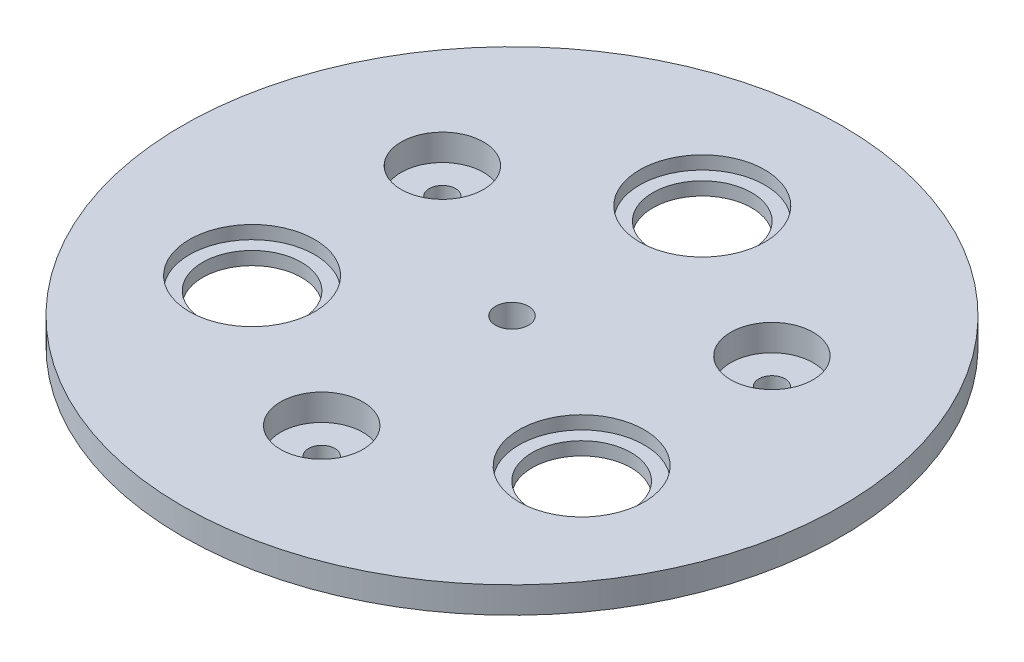
ISO-10303-21;
HEADER;
FILE_DESCRIPTION(('STEP AP214'),'2;1');
FILE_NAME('part.step','',(''),(''),'','','');
FILE_SCHEMA(('AUTOMOTIVE_DESIGN { 1 0 10303 214 1 1 1 1 }'));
ENDSEC;
DATA;
#1=APPLICATION_CONTEXT('core data for automotive mechanical design processes');
#2=APPLICATION_PROTOCOL_DEFINITION('international standard','automotive_design',2000,#1);
#3=PRODUCT_CONTEXT('',#1,'mechanical');
#4=PRODUCT('Part','Part','',(#3));
#5=PRODUCT_RELATED_PRODUCT_CATEGORY('part','',(#4));
#6=PRODUCT_DEFINITION_FORMATION('','',#4);
#7=PRODUCT_DEFINITION_CONTEXT('part definition',#1,'design');
#8=PRODUCT_DEFINITION('design','',#6,#7);
#9=PRODUCT_DEFINITION_SHAPE('','',#8);
#10=(LENGTH_UNIT() NAMED_UNIT(*) SI_UNIT(.MILLI.,.METRE.));
#11=(NAMED_UNIT(*) PLANE_ANGLE_UNIT() SI_UNIT($,.RADIAN.));
#12=(NAMED_UNIT(*) SI_UNIT($,.STERADIAN.) SOLID_ANGLE_UNIT());
#13=UNCERTAINTY_MEASURE_WITH_UNIT(LENGTH_MEASURE(1.E-05),#10,'distance_accuracy_value','');
#14=(GEOMETRIC_REPRESENTATION_CONTEXT(3) GLOBAL_UNCERTAINTY_ASSIGNED_CONTEXT((#13)) GLOBAL_UNIT_ASSIGNED_CONTEXT((#10,
#11,#12)) REPRESENTATION_CONTEXT('',''));
#15=CARTESIAN_POINT('',(0.,0.,0.));
#16=DIRECTION('',(0.,0.,1.));
#17=DIRECTION('',(1.,0.,0.));
#18=AXIS2_PLACEMENT_3D('',#15,#16,#17);
#19=CARTESIAN_POINT('',(0.,-2.,0.));
#20=DIRECTION('',(0.,1.,0.));
#21=DIRECTION('',(0.,0.,1.));
#22=AXIS2_PLACEMENT_3D('',#19,#20,#21);
#23=PLANE('',#22);
#24=CARTESIAN_POINT('',(0.,-2.,0.));
#25=DIRECTION('',(0.,1.,0.));
#26=DIRECTION('',(0.,0.,1.));
#27=AXIS2_PLACEMENT_3D('',#24,#25,#26);
#28=CIRCLE('',#27,2.5);
#29=CARTESIAN_POINT('',(0.,-2.,2.5));
#30=VERTEX_POINT('',#29);
#31=EDGE_CURVE('E63',#30,#30,#28,.T.);
#32=ORIENTED_EDGE('',*,*,#31,.T.);
#33=EDGE_LOOP('',(#32));
#34=FACE_BOUND('',#33,.T.);
#35=CARTESIAN_POINT('',(0.,-2.,0.));
#36=DIRECTION('',(0.,-1.,0.));
#37=DIRECTION('',(0.,0.,-1.));
#38=AXIS2_PLACEMENT_3D('',#35,#36,#37);
#39=CIRCLE('',#38,6.25);
#40=CARTESIAN_POINT('',(0.,-2.,-6.25));
#41=VERTEX_POINT('',#40);
#42=EDGE_CURVE('E150',#41,#41,#39,.T.);
#43=ORIENTED_EDGE('',*,*,#42,.T.);
#44=EDGE_LOOP('',(#43));
#45=FACE_BOUND('',#44,.T.);
#46=ADVANCED_FACE('F39',(#34,#45),#23,.F.);
#47=CARTESIAN_POINT('',(0.,0.,0.));
#48=DIRECTION('',(0.,1.,0.));
#49=DIRECTION('',(0.,0.,1.));
#50=AXIS2_PLACEMENT_3D('',#47,#48,#49);
#51=PLANE('',#50);
#52=CARTESIAN_POINT('',(0.,0.,-28.8675134594814));
#53=DIRECTION('',(0.,1.,0.));
#54=DIRECTION('',(0.,0.,1.));
#55=AXIS2_PLACEMENT_3D('',#52,#53,#54);
#56=CIRCLE('',#55,7.5);
#57=CARTESIAN_POINT('',(0.,0.,-21.3675134594814));
#58=VERTEX_POINT('',#57);
#59=EDGE_CURVE('E60',#58,#58,#56,.T.);
#60=ORIENTED_EDGE('',*,*,#59,.F.);
#61=EDGE_LOOP('',(#60));
#62=FACE_BOUND('',#61,.T.);
#63=CARTESIAN_POINT('',(0.,0.,-28.8675134594813));
#64=DIRECTION('',(0.,1.,0.));
#65=DIRECTION('',(0.,0.,1.));
#66=AXIS2_PLACEMENT_3D('',#63,#64,#65);
#67=CIRCLE('',#66,9.5);
#68=CARTESIAN_POINT('',(0.,0.,-19.3675134594813));
#69=VERTEX_POINT('',#68);
#70=EDGE_CURVE('E91',#69,#69,#67,.T.);
#71=ORIENTED_EDGE('',*,*,#70,.T.);
#72=EDGE_LOOP('',(#71));
#73=FACE_BOUND('',#72,.T.);
#74=ADVANCED_FACE('F178',(#62,#73),#51,.T.);
#75=CARTESIAN_POINT('',(25.0000000000002,0.,14.4337567297405));
#76=DIRECTION('',(0.,1.,0.));
#77=DIRECTION('',(0.,0.,1.));
#78=AXIS2_PLACEMENT_3D('',#75,#76,#77);
#79=CIRCLE('',#78,7.5);
#80=CARTESIAN_POINT('',(25.0000000000002,0.,21.9337567297405));
#81=VERTEX_POINT('',#80);
#82=EDGE_CURVE('E64',#81,#81,#79,.T.);
#83=ORIENTED_EDGE('',*,*,#82,.F.);
#84=EDGE_LOOP('',(#83));
#85=FACE_BOUND('',#84,.T.);
#86=CARTESIAN_POINT('',(25.,0.,14.4337567297406));
#87=DIRECTION('',(0.,1.,0.));
#88=DIRECTION('',(0.,0.,1.));
#89=AXIS2_PLACEMENT_3D('',#86,#87,#88);
#90=CIRCLE('',#89,9.5);
#91=CARTESIAN_POINT('',(25.,0.,23.9337567297406));
#92=VERTEX_POINT('',#91);
#93=EDGE_CURVE('E88',#92,#92,#90,.T.);
#94=ORIENTED_EDGE('',*,*,#93,.T.);
#95=EDGE_LOOP('',(#94));
#96=FACE_BOUND('',#95,.T.);
#97=ADVANCED_FACE('F185',(#85,#96),#51,.T.);
#98=CARTESIAN_POINT('',(-25.,0.,14.4337567297408));
#99=DIRECTION('',(0.,1.,0.));
#100=DIRECTION('',(0.,0.,1.));
#101=AXIS2_PLACEMENT_3D('',#98,#99,#100);
#102=CIRCLE('',#101,7.5);
#103=CARTESIAN_POINT('',(-25.,0.,21.9337567297408));
#104=VERTEX_POINT('',#103);
#105=EDGE_CURVE('E67',#104,#104,#102,.T.);
#106=ORIENTED_EDGE('',*,*,#105,.F.);
#107=EDGE_LOOP('',(#106));
#108=FACE_BOUND('',#107,.T.);
#109=CARTESIAN_POINT('',(-25.,0.,14.4337567297406));
#110=DIRECTION('',(0.,1.,0.));
#111=DIRECTION('',(0.,0.,1.));
#112=AXIS2_PLACEMENT_3D('',#109,#110,#111);
#113=CIRCLE('',#112,9.5);
#114=CARTESIAN_POINT('',(-25.,0.,23.9337567297406));
#115=VERTEX_POINT('',#114);
#116=EDGE_CURVE('E84',#115,#115,#113,.T.);
#117=ORIENTED_EDGE('',*,*,#116,.T.);
#118=EDGE_LOOP('',(#117));
#119=FACE_BOUND('',#118,.T.);
#120=ADVANCED_FACE('F188',(#108,#119),#51,.T.);
#121=CARTESIAN_POINT('',(25.0000000000002,-2.,14.4337567297405));
#122=DIRECTION('',(0.,1.,0.));
#123=DIRECTION('',(0.,0.,1.));
#124=AXIS2_PLACEMENT_3D('',#121,#122,#123);
#125=CYLINDRICAL_SURFACE('',#124,7.5);
#126=CARTESIAN_POINT('',(25.0000000000002,-2.,14.4337567297405));
#127=DIRECTION('',(0.,1.,0.));
#128=DIRECTION('',(0.,0.,1.));
#129=AXIS2_PLACEMENT_3D('',#126,#127,#128);
#130=CIRCLE('',#129,7.5);
#131=CARTESIAN_POINT('',(25.0000000000002,-2.,21.9337567297405));
#132=VERTEX_POINT('',#131);
#133=EDGE_CURVE('E73',#132,#132,#130,.T.);
#134=ORIENTED_EDGE('',*,*,#133,.F.);
#135=EDGE_LOOP('',(#134));
#136=FACE_BOUND('',#135,.T.);
#137=ORIENTED_EDGE('',*,*,#82,.T.);
#138=EDGE_LOOP('',(#137));
#139=FACE_BOUND('',#138,.T.);
#140=ADVANCED_FACE('F325',(#136,#139),#125,.F.);
#141=CARTESIAN_POINT('',(-25.,-2.,14.4337567297408));
#142=DIRECTION('',(0.,1.,0.));
#143=DIRECTION('',(0.,0.,1.));
#144=AXIS2_PLACEMENT_3D('',#141,#142,#143);
#145=CYLINDRICAL_SURFACE('',#144,7.5);
#146=CARTESIAN_POINT('',(-25.,-2.,14.4337567297408));
#147=DIRECTION('',(0.,1.,0.));
#148=DIRECTION('',(0.,0.,1.));
#149=AXIS2_PLACEMENT_3D('',#146,#147,#148);
#150=CIRCLE('',#149,7.5);
#151=CARTESIAN_POINT('',(-25.,-2.,21.9337567297408));
#152=VERTEX_POINT('',#151);
#153=EDGE_CURVE('E76',#152,#152,#150,.T.);
#154=ORIENTED_EDGE('',*,*,#153,.F.);
#155=EDGE_LOOP('',(#154));
#156=FACE_BOUND('',#155,.T.);
#157=ORIENTED_EDGE('',*,*,#105,.T.);
#158=EDGE_LOOP('',(#157));
#159=FACE_BOUND('',#158,.T.);
#160=ADVANCED_FACE('F318',(#156,#159),#145,.F.);
#161=CARTESIAN_POINT('',(0.,-2.,0.));
#162=DIRECTION('',(0.,1.,0.));
#163=DIRECTION('',(0.,0.,1.));
#164=AXIS2_PLACEMENT_3D('',#161,#162,#163);
#165=CYLINDRICAL_SURFACE('',#164,50.);
#166=CARTESIAN_POINT('',(0.,-2.,0.));
#167=DIRECTION('',(0.,1.,0.));
#168=DIRECTION('',(0.,0.,1.));
#169=AXIS2_PLACEMENT_3D('',#166,#167,#168);
#170=CIRCLE('',#169,50.);
#171=CARTESIAN_POINT('',(0.,-2.,50.));
#172=VERTEX_POINT('',#171);
#173=EDGE_CURVE('E79',#172,#172,#170,.T.);
#174=ORIENTED_EDGE('',*,*,#173,.T.);
#175=EDGE_LOOP('',(#174));
#176=FACE_BOUND('',#175,.T.);
#177=CARTESIAN_POINT('',(0.,2.,0.));
#178=DIRECTION('',(0.,1.,0.));
#179=DIRECTION('',(0.,0.,1.));
#180=AXIS2_PLACEMENT_3D('',#177,#178,#179);
#181=CIRCLE('',#180,50.);
#182=CARTESIAN_POINT('',(0.,2.,50.));
#183=VERTEX_POINT('',#182);
#184=EDGE_CURVE('E70',#183,#183,#181,.T.);
#185=ORIENTED_EDGE('',*,*,#184,.F.);
#186=EDGE_LOOP('',(#185));
#187=FACE_BOUND('',#186,.T.);
#188=ADVANCED_FACE('F316',(#176,#187),#165,.T.);
#189=CARTESIAN_POINT('',(0.,-2.,0.));
#190=DIRECTION('',(0.,1.,0.));
#191=DIRECTION('',(0.,0.,1.));
#192=AXIS2_PLACEMENT_3D('',#189,#190,#191);
#193=CYLINDRICAL_SURFACE('',#192,2.5);
#194=ORIENTED_EDGE('',*,*,#31,.F.);
#195=EDGE_LOOP('',(#194));
#196=FACE_BOUND('',#195,.T.);
#197=CARTESIAN_POINT('',(0.,2.,0.));
#198=DIRECTION('',(0.,1.,0.));
#199=DIRECTION('',(0.,0.,1.));
#200=AXIS2_PLACEMENT_3D('',#197,#198,#199);
#201=CIRCLE('',#200,2.5);
#202=CARTESIAN_POINT('',(0.,2.,2.5));
#203=VERTEX_POINT('',#202);
#204=EDGE_CURVE('E87',#203,#203,#201,.T.);
#205=ORIENTED_EDGE('',*,*,#204,.T.);
#206=EDGE_LOOP('',(#205));
#207=FACE_BOUND('',#206,.T.);
#208=ADVANCED_FACE('F41',(#196,#207),#193,.F.);
#209=CARTESIAN_POINT('',(0.,-2.,-28.8675134594814));
#210=DIRECTION('',(0.,1.,0.));
#211=DIRECTION('',(0.,0.,1.));
#212=AXIS2_PLACEMENT_3D('',#209,#210,#211);
#213=CYLINDRICAL_SURFACE('',#212,7.5);
#214=CARTESIAN_POINT('',(0.,-2.,-28.8675134594814));
#215=DIRECTION('',(0.,1.,0.));
#216=DIRECTION('',(0.,0.,1.));
#217=AXIS2_PLACEMENT_3D('',#214,#215,#216);
#218=CIRCLE('',#217,7.5);
#219=CARTESIAN_POINT('',(0.,-2.,-21.3675134594814));
#220=VERTEX_POINT('',#219);
#221=EDGE_CURVE('E59',#220,#220,#218,.T.);
#222=ORIENTED_EDGE('',*,*,#221,.F.);
#223=EDGE_LOOP('',(#222));
#224=FACE_BOUND('',#223,.T.);
#225=ORIENTED_EDGE('',*,*,#59,.T.);
#226=EDGE_LOOP('',(#225));
#227=FACE_BOUND('',#226,.T.);
#228=ADVANCED_FACE('F193',(#224,#227),#213,.F.);
#229=CARTESIAN_POINT('',(0.,-2.,0.));
#230=DIRECTION('',(0.,1.,0.));
#231=DIRECTION('',(0.,0.,1.));
#232=AXIS2_PLACEMENT_3D('',#229,#230,#231);
#233=CIRCLE('',#232,9.75);
#234=CARTESIAN_POINT('',(0.,-2.,9.75));
#235=VERTEX_POINT('',#234);
#236=EDGE_CURVE('E11',#235,#235,#233,.F.);
#237=ORIENTED_EDGE('',*,*,#236,.F.);
#238=EDGE_LOOP('',(#237));
#239=FACE_BOUND('',#238,.T.);
#240=CARTESIAN_POINT('',(25.,-2.,-14.4337567297407));
#241=DIRECTION('',(0.,1.,0.));
#242=DIRECTION('',(0.,0.,1.));
#243=AXIS2_PLACEMENT_3D('',#240,#241,#242);
#244=CIRCLE('',#243,9.25000000000001);
#245=CARTESIAN_POINT('',(25.,-2.,-5.18375672974065));
#246=VERTEX_POINT('',#245);
#247=EDGE_CURVE('E46',#246,#246,#244,.F.);
#248=ORIENTED_EDGE('',*,*,#247,.F.);
#249=EDGE_LOOP('',(#248));
#250=FACE_BOUND('',#249,.T.);
#251=CARTESIAN_POINT('',(-25.,-2.,-14.4337567297406));
#252=DIRECTION('',(0.,1.,0.));
#253=DIRECTION('',(0.,0.,1.));
#254=AXIS2_PLACEMENT_3D('',#251,#252,#253);
#255=CIRCLE('',#254,9.25);
#256=CARTESIAN_POINT('',(-25.,-2.,-5.18375672974063));
#257=VERTEX_POINT('',#256);
#258=EDGE_CURVE('E50',#257,#257,#255,.F.);
#259=ORIENTED_EDGE('',*,*,#258,.F.);
#260=EDGE_LOOP('',(#259));
#261=FACE_BOUND('',#260,.T.);
#262=CARTESIAN_POINT('',(0.,-2.,28.8675134594813));
#263=DIRECTION('',(0.,1.,0.));
#264=DIRECTION('',(0.,0.,1.));
#265=AXIS2_PLACEMENT_3D('',#262,#263,#264);
#266=CIRCLE('',#265,9.25);
#267=CARTESIAN_POINT('',(0.,-2.,38.1175134594813));
#268=VERTEX_POINT('',#267);
#269=EDGE_CURVE('E54',#268,#268,#266,.F.);
#270=ORIENTED_EDGE('',*,*,#269,.F.);
#271=EDGE_LOOP('',(#270));
#272=FACE_BOUND('',#271,.T.);
#273=ORIENTED_EDGE('',*,*,#173,.F.);
#274=EDGE_LOOP('',(#273));
#275=FACE_BOUND('',#274,.T.);
#276=ORIENTED_EDGE('',*,*,#153,.T.);
#277=EDGE_LOOP('',(#276));
#278=FACE_BOUND('',#277,.T.);
#279=ORIENTED_EDGE('',*,*,#133,.T.);
#280=EDGE_LOOP('',(#279));
#281=FACE_BOUND('',#280,.T.);
#282=ORIENTED_EDGE('',*,*,#221,.T.);
#283=EDGE_LOOP('',(#282));
#284=FACE_BOUND('',#283,.T.);
#285=ADVANCED_FACE('F181',(#239,#250,#261,#272,#275,#278,#281,#284),#23,.F.);
#286=CARTESIAN_POINT('',(-25.,2.,14.4337567297406));
#287=DIRECTION('',(0.,-1.,0.));
#288=DIRECTION('',(0.,0.,-1.));
#289=AXIS2_PLACEMENT_3D('',#286,#287,#288);
#290=CYLINDRICAL_SURFACE('',#289,9.5);
#291=CARTESIAN_POINT('',(-25.,2.,14.4337567297406));
#292=DIRECTION('',(0.,1.,0.));
#293=DIRECTION('',(0.,0.,1.));
#294=AXIS2_PLACEMENT_3D('',#291,#292,#293);
#295=CIRCLE('',#294,9.5);
#296=CARTESIAN_POINT('',(-25.,2.,23.9337567297406));
#297=VERTEX_POINT('',#296);
#298=EDGE_CURVE('E97',#297,#297,#295,.T.);
#299=ORIENTED_EDGE('',*,*,#298,.T.);
#300=EDGE_LOOP('',(#299));
#301=FACE_BOUND('',#300,.T.);
#302=ORIENTED_EDGE('',*,*,#116,.F.);
#303=EDGE_LOOP('',(#302));
#304=FACE_BOUND('',#303,.T.);
#305=ADVANCED_FACE('F192',(#301,#304),#290,.F.);
#306=CARTESIAN_POINT('',(25.,2.,14.4337567297406));
#307=DIRECTION('',(0.,-1.,0.));
#308=DIRECTION('',(0.,0.,-1.));
#309=AXIS2_PLACEMENT_3D('',#306,#307,#308);
#310=CYLINDRICAL_SURFACE('',#309,9.5);
#311=CARTESIAN_POINT('',(25.,2.,14.4337567297406));
#312=DIRECTION('',(0.,1.,0.));
#313=DIRECTION('',(0.,0.,1.));
#314=AXIS2_PLACEMENT_3D('',#311,#312,#313);
#315=CIRCLE('',#314,9.5);
#316=CARTESIAN_POINT('',(25.,2.,23.9337567297406));
#317=VERTEX_POINT('',#316);
#318=EDGE_CURVE('E100',#317,#317,#315,.T.);
#319=ORIENTED_EDGE('',*,*,#318,.T.);
#320=EDGE_LOOP('',(#319));
#321=FACE_BOUND('',#320,.T.);
#322=ORIENTED_EDGE('',*,*,#93,.F.);
#323=EDGE_LOOP('',(#322));
#324=FACE_BOUND('',#323,.T.);
#325=ADVANCED_FACE('F199',(#321,#324),#310,.F.);
#326=CARTESIAN_POINT('',(0.,2.,-28.8675134594813));
#327=DIRECTION('',(0.,-1.,0.));
#328=DIRECTION('',(0.,0.,-1.));
#329=AXIS2_PLACEMENT_3D('',#326,#327,#328);
#330=CYLINDRICAL_SURFACE('',#329,9.5);
#331=CARTESIAN_POINT('',(0.,2.,-28.8675134594813));
#332=DIRECTION('',(0.,1.,0.));
#333=DIRECTION('',(0.,0.,1.));
#334=AXIS2_PLACEMENT_3D('',#331,#332,#333);
#335=CIRCLE('',#334,9.5);
#336=CARTESIAN_POINT('',(0.,2.,-19.3675134594813));
#337=VERTEX_POINT('',#336);
#338=EDGE_CURVE('E103',#337,#337,#335,.T.);
#339=ORIENTED_EDGE('',*,*,#338,.T.);
#340=EDGE_LOOP('',(#339));
#341=FACE_BOUND('',#340,.T.);
#342=ORIENTED_EDGE('',*,*,#70,.F.);
#343=EDGE_LOOP('',(#342));
#344=FACE_BOUND('',#343,.T.);
#345=ADVANCED_FACE('F222',(#341,#344),#330,.F.);
#346=CARTESIAN_POINT('',(0.,2.,0.));
#347=DIRECTION('',(0.,1.,0.));
#348=DIRECTION('',(0.,0.,1.));
#349=AXIS2_PLACEMENT_3D('',#346,#347,#348);
#350=PLANE('',#349);
#351=CARTESIAN_POINT('',(-25.,2.,-14.4337567297406));
#352=DIRECTION('',(0.,1.,0.));
#353=DIRECTION('',(0.,0.,1.));
#354=AXIS2_PLACEMENT_3D('',#351,#352,#353);
#355=CIRCLE('',#354,6.25);
#356=CARTESIAN_POINT('',(-25.,2.,-8.18375672974063));
#357=VERTEX_POINT('',#356);
#358=EDGE_CURVE('E119',#357,#357,#355,.T.);
#359=ORIENTED_EDGE('',*,*,#358,.F.);
#360=EDGE_LOOP('',(#359));
#361=FACE_BOUND('',#360,.T.);
#362=CARTESIAN_POINT('',(25.,2.,-14.4337567297407));
#363=DIRECTION('',(0.,1.,0.));
#364=DIRECTION('',(0.,0.,1.));
#365=AXIS2_PLACEMENT_3D('',#362,#363,#364);
#366=CIRCLE('',#365,6.25);
#367=CARTESIAN_POINT('',(25.,2.,-8.18375672974065));
#368=VERTEX_POINT('',#367);
#369=EDGE_CURVE('E116',#368,#368,#366,.T.);
#370=ORIENTED_EDGE('',*,*,#369,.F.);
#371=EDGE_LOOP('',(#370));
#372=FACE_BOUND('',#371,.T.);
#373=CARTESIAN_POINT('',(0.,2.,28.8675134594813));
#374=DIRECTION('',(0.,1.,0.));
#375=DIRECTION('',(0.,0.,1.));
#376=AXIS2_PLACEMENT_3D('',#373,#374,#375);
#377=CIRCLE('',#376,6.25);
#378=CARTESIAN_POINT('',(0.,2.,35.1175134594813));
#379=VERTEX_POINT('',#378);
#380=EDGE_CURVE('E108',#379,#379,#377,.T.);
#381=ORIENTED_EDGE('',*,*,#380,.F.);
#382=EDGE_LOOP('',(#381));
#383=FACE_BOUND('',#382,.T.);
#384=ORIENTED_EDGE('',*,*,#204,.F.);
#385=EDGE_LOOP('',(#384));
#386=FACE_BOUND('',#385,.T.);
#387=ORIENTED_EDGE('',*,*,#338,.F.);
#388=EDGE_LOOP('',(#387));
#389=FACE_BOUND('',#388,.T.);
#390=ORIENTED_EDGE('',*,*,#318,.F.);
#391=EDGE_LOOP('',(#390));
#392=FACE_BOUND('',#391,.T.);
#393=ORIENTED_EDGE('',*,*,#298,.F.);
#394=EDGE_LOOP('',(#393));
#395=FACE_BOUND('',#394,.T.);
#396=ORIENTED_EDGE('',*,*,#184,.T.);
#397=EDGE_LOOP('',(#396));
#398=FACE_BOUND('',#397,.T.);
#399=ADVANCED_FACE('F224',(#361,#372,#383,#386,#389,#392,#395,#398),#350,.T.);
#400=CARTESIAN_POINT('',(0.,-2.,28.8675134594813));
#401=DIRECTION('',(0.,1.,0.));
#402=DIRECTION('',(0.,0.,1.));
#403=AXIS2_PLACEMENT_3D('',#400,#401,#402);
#404=CYLINDRICAL_SURFACE('',#403,6.25);
#405=CARTESIAN_POINT('',(0.,-2.,28.8675134594813));
#406=DIRECTION('',(0.,1.,0.));
#407=DIRECTION('',(0.,0.,1.));
#408=AXIS2_PLACEMENT_3D('',#405,#406,#407);
#409=CIRCLE('',#408,6.25);
#410=CARTESIAN_POINT('',(0.,-2.,35.1175134594813));
#411=VERTEX_POINT('',#410);
#412=EDGE_CURVE('E112',#411,#411,#409,.T.);
#413=ORIENTED_EDGE('',*,*,#412,.F.);
#414=EDGE_LOOP('',(#413));
#415=FACE_BOUND('',#414,.T.);
#416=ORIENTED_EDGE('',*,*,#380,.T.);
#417=EDGE_LOOP('',(#416));
#418=FACE_BOUND('',#417,.T.);
#419=ADVANCED_FACE('F230',(#415,#418),#404,.F.);
#420=CARTESIAN_POINT('',(25.,-2.,-14.4337567297407));
#421=DIRECTION('',(0.,1.,0.));
#422=DIRECTION('',(0.,0.,1.));
#423=AXIS2_PLACEMENT_3D('',#420,#421,#422);
#424=CYLINDRICAL_SURFACE('',#423,6.25);
#425=CARTESIAN_POINT('',(25.,-2.,-14.4337567297407));
#426=DIRECTION('',(0.,1.,0.));
#427=DIRECTION('',(0.,0.,1.));
#428=AXIS2_PLACEMENT_3D('',#425,#426,#427);
#429=CIRCLE('',#428,6.25);
#430=CARTESIAN_POINT('',(25.,-2.,-8.18375672974065));
#431=VERTEX_POINT('',#430);
#432=EDGE_CURVE('E111',#431,#431,#429,.T.);
#433=ORIENTED_EDGE('',*,*,#432,.F.);
#434=EDGE_LOOP('',(#433));
#435=FACE_BOUND('',#434,.T.);
#436=ORIENTED_EDGE('',*,*,#369,.T.);
#437=EDGE_LOOP('',(#436));
#438=FACE_BOUND('',#437,.T.);
#439=ADVANCED_FACE('F238',(#435,#438),#424,.F.);
#440=CARTESIAN_POINT('',(-25.,-2.,-14.4337567297406));
#441=DIRECTION('',(0.,1.,0.));
#442=DIRECTION('',(0.,0.,1.));
#443=AXIS2_PLACEMENT_3D('',#440,#441,#442);
#444=CYLINDRICAL_SURFACE('',#443,6.25);
#445=CARTESIAN_POINT('',(-25.,-2.,-14.4337567297406));
#446=DIRECTION('',(0.,1.,0.));
#447=DIRECTION('',(0.,0.,1.));
#448=AXIS2_PLACEMENT_3D('',#445,#446,#447);
#449=CIRCLE('',#448,6.25);
#450=CARTESIAN_POINT('',(-25.,-2.,-8.18375672974063));
#451=VERTEX_POINT('',#450);
#452=EDGE_CURVE('E94',#451,#451,#449,.T.);
#453=ORIENTED_EDGE('',*,*,#452,.F.);
#454=EDGE_LOOP('',(#453));
#455=FACE_BOUND('',#454,.T.);
#456=ORIENTED_EDGE('',*,*,#358,.T.);
#457=EDGE_LOOP('',(#456));
#458=FACE_BOUND('',#457,.T.);
#459=ADVANCED_FACE('F242',(#455,#458),#444,.F.);
#460=CARTESIAN_POINT('',(0.,-2.,0.));
#461=DIRECTION('',(0.,-1.,0.));
#462=DIRECTION('',(0.,0.,-1.));
#463=AXIS2_PLACEMENT_3D('',#460,#461,#462);
#464=PLANE('',#463);
#465=CARTESIAN_POINT('',(0.,-2.,28.8675134594813));
#466=DIRECTION('',(0.,-1.,0.));
#467=DIRECTION('',(0.,0.,-1.));
#468=AXIS2_PLACEMENT_3D('',#465,#466,#467);
#469=CIRCLE('',#468,2.);
#470=CARTESIAN_POINT('',(0.,-2.,26.8675134594813));
#471=VERTEX_POINT('',#470);
#472=EDGE_CURVE('E126',#471,#471,#469,.T.);
#473=ORIENTED_EDGE('',*,*,#472,.T.);
#474=EDGE_LOOP('',(#473));
#475=FACE_BOUND('',#474,.T.);
#476=ORIENTED_EDGE('',*,*,#412,.T.);
#477=EDGE_LOOP('',(#476));
#478=FACE_BOUND('',#477,.T.);
#479=ADVANCED_FACE('F246',(#475,#478),#464,.F.);
#480=CARTESIAN_POINT('',(0.,-5.,28.8675134594813));
#481=DIRECTION('',(0.,1.,0.));
#482=DIRECTION('',(0.,0.,1.));
#483=AXIS2_PLACEMENT_3D('',#480,#481,#482);
#484=CYLINDRICAL_SURFACE('',#483,2.);
#485=CARTESIAN_POINT('',(0.,-5.,28.8675134594813));
#486=DIRECTION('',(0.,-1.,0.));
#487=DIRECTION('',(0.,0.,-1.));
#488=AXIS2_PLACEMENT_3D('',#485,#486,#487);
#489=CIRCLE('',#488,2.);
#490=CARTESIAN_POINT('',(0.,-5.,26.8675134594813));
#491=VERTEX_POINT('',#490);
#492=EDGE_CURVE('E129',#491,#491,#489,.T.);
#493=ORIENTED_EDGE('',*,*,#492,.T.);
#494=EDGE_LOOP('',(#493));
#495=FACE_BOUND('',#494,.T.);
#496=ORIENTED_EDGE('',*,*,#472,.F.);
#497=EDGE_LOOP('',(#496));
#498=FACE_BOUND('',#497,.T.);
#499=ADVANCED_FACE('F248',(#495,#498),#484,.F.);
#500=CARTESIAN_POINT('',(0.,-5.,28.8675134594813));
#501=DIRECTION('',(0.,1.,0.));
#502=DIRECTION('',(0.,0.,1.));
#503=AXIS2_PLACEMENT_3D('',#500,#501,#502);
#504=CYLINDRICAL_SURFACE('',#503,9.25);
#505=CARTESIAN_POINT('',(0.,-5.,28.8675134594813));
#506=DIRECTION('',(0.,-1.,0.));
#507=DIRECTION('',(0.,0.,-1.));
#508=AXIS2_PLACEMENT_3D('',#505,#506,#507);
#509=CIRCLE('',#508,9.25);
#510=CARTESIAN_POINT('',(0.,-5.,19.6175134594813));
#511=VERTEX_POINT('',#510);
#512=EDGE_CURVE('E115',#511,#511,#509,.T.);
#513=ORIENTED_EDGE('',*,*,#512,.F.);
#514=EDGE_LOOP('',(#513));
#515=FACE_BOUND('',#514,.T.);
#516=ORIENTED_EDGE('',*,*,#269,.T.);
#517=EDGE_LOOP('',(#516));
#518=FACE_BOUND('',#517,.T.);
#519=ADVANCED_FACE('F251',(#515,#518),#504,.T.);
#520=CARTESIAN_POINT('',(0.,-5.,0.));
#521=DIRECTION('',(0.,-1.,0.));
#522=DIRECTION('',(0.,0.,-1.));
#523=AXIS2_PLACEMENT_3D('',#520,#521,#522);
#524=PLANE('',#523);
#525=ORIENTED_EDGE('',*,*,#492,.F.);
#526=EDGE_LOOP('',(#525));
#527=FACE_BOUND('',#526,.T.);
#528=ORIENTED_EDGE('',*,*,#512,.T.);
#529=EDGE_LOOP('',(#528));
#530=FACE_BOUND('',#529,.T.);
#531=ADVANCED_FACE('F255',(#527,#530),#524,.T.);
#532=CARTESIAN_POINT('',(0.,-2.,0.));
#533=DIRECTION('',(0.,-1.,0.));
#534=DIRECTION('',(0.,0.,-1.));
#535=AXIS2_PLACEMENT_3D('',#532,#533,#534);
#536=PLANE('',#535);
#537=CARTESIAN_POINT('',(-25.,-2.,-14.4337567297406));
#538=DIRECTION('',(0.,-1.,0.));
#539=DIRECTION('',(0.,0.,-1.));
#540=AXIS2_PLACEMENT_3D('',#537,#538,#539);
#541=CIRCLE('',#540,2.00000000000025);
#542=CARTESIAN_POINT('',(-25.,-2.,-16.4337567297409));
#543=VERTEX_POINT('',#542);
#544=EDGE_CURVE('E130',#543,#543,#541,.T.);
#545=ORIENTED_EDGE('',*,*,#544,.T.);
#546=EDGE_LOOP('',(#545));
#547=FACE_BOUND('',#546,.T.);
#548=ORIENTED_EDGE('',*,*,#452,.T.);
#549=EDGE_LOOP('',(#548));
#550=FACE_BOUND('',#549,.T.);
#551=ADVANCED_FACE('F262',(#547,#550),#536,.F.);
#552=CARTESIAN_POINT('',(-25.,-5.,-14.4337567297406));
#553=DIRECTION('',(0.,1.,0.));
#554=DIRECTION('',(0.,0.,1.));
#555=AXIS2_PLACEMENT_3D('',#552,#553,#554);
#556=CYLINDRICAL_SURFACE('',#555,2.00000000000025);
#557=CARTESIAN_POINT('',(-25.,-5.,-14.4337567297406));
#558=DIRECTION('',(0.,-1.,0.));
#559=DIRECTION('',(0.,0.,-1.));
#560=AXIS2_PLACEMENT_3D('',#557,#558,#559);
#561=CIRCLE('',#560,2.00000000000025);
#562=CARTESIAN_POINT('',(-25.,-5.,-16.4337567297409));
#563=VERTEX_POINT('',#562);
#564=EDGE_CURVE('E135',#563,#563,#561,.T.);
#565=ORIENTED_EDGE('',*,*,#564,.T.);
#566=EDGE_LOOP('',(#565));
#567=FACE_BOUND('',#566,.T.);
#568=ORIENTED_EDGE('',*,*,#544,.F.);
#569=EDGE_LOOP('',(#568));
#570=FACE_BOUND('',#569,.T.);
#571=ADVANCED_FACE('F272',(#567,#570),#556,.F.);
#572=CARTESIAN_POINT('',(-25.,-5.,-14.4337567297406));
#573=DIRECTION('',(0.,1.,0.));
#574=DIRECTION('',(0.,0.,1.));
#575=AXIS2_PLACEMENT_3D('',#572,#573,#574);
#576=CYLINDRICAL_SURFACE('',#575,9.25);
#577=CARTESIAN_POINT('',(-25.,-5.,-14.4337567297406));
#578=DIRECTION('',(0.,-1.,0.));
#579=DIRECTION('',(0.,0.,-1.));
#580=AXIS2_PLACEMENT_3D('',#577,#578,#579);
#581=CIRCLE('',#580,9.25);
#582=CARTESIAN_POINT('',(-25.,-5.,-23.6837567297406));
#583=VERTEX_POINT('',#582);
#584=EDGE_CURVE('E138',#583,#583,#581,.T.);
#585=ORIENTED_EDGE('',*,*,#584,.F.);
#586=EDGE_LOOP('',(#585));
#587=FACE_BOUND('',#586,.T.);
#588=ORIENTED_EDGE('',*,*,#258,.T.);
#589=EDGE_LOOP('',(#588));
#590=FACE_BOUND('',#589,.T.);
#591=ADVANCED_FACE('F268',(#587,#590),#576,.T.);
#592=CARTESIAN_POINT('',(0.,-5.,0.));
#593=DIRECTION('',(0.,-1.,0.));
#594=DIRECTION('',(0.,0.,-1.));
#595=AXIS2_PLACEMENT_3D('',#592,#593,#594);
#596=PLANE('',#595);
#597=ORIENTED_EDGE('',*,*,#564,.F.);
#598=EDGE_LOOP('',(#597));
#599=FACE_BOUND('',#598,.T.);
#600=ORIENTED_EDGE('',*,*,#584,.T.);
#601=EDGE_LOOP('',(#600));
#602=FACE_BOUND('',#601,.T.);
#603=ADVANCED_FACE('F264',(#599,#602),#596,.T.);
#604=CARTESIAN_POINT('',(0.,-2.,0.));
#605=DIRECTION('',(0.,-1.,0.));
#606=DIRECTION('',(0.,0.,-1.));
#607=AXIS2_PLACEMENT_3D('',#604,#605,#606);
#608=PLANE('',#607);
#609=CARTESIAN_POINT('',(25.,-2.,-14.4337567297407));
#610=DIRECTION('',(0.,-1.,0.));
#611=DIRECTION('',(0.,0.,-1.));
#612=AXIS2_PLACEMENT_3D('',#609,#610,#611);
#613=CIRCLE('',#612,2.00000000000013);
#614=CARTESIAN_POINT('',(25.,-2.,-16.4337567297408));
#615=VERTEX_POINT('',#614);
#616=EDGE_CURVE('E141',#615,#615,#613,.T.);
#617=ORIENTED_EDGE('',*,*,#616,.T.);
#618=EDGE_LOOP('',(#617));
#619=FACE_BOUND('',#618,.T.);
#620=ORIENTED_EDGE('',*,*,#432,.T.);
#621=EDGE_LOOP('',(#620));
#622=FACE_BOUND('',#621,.T.);
#623=ADVANCED_FACE('F267',(#619,#622),#608,.F.);
#624=CARTESIAN_POINT('',(25.,-5.,-14.4337567297407));
#625=DIRECTION('',(0.,1.,0.));
#626=DIRECTION('',(0.,0.,1.));
#627=AXIS2_PLACEMENT_3D('',#624,#625,#626);
#628=CYLINDRICAL_SURFACE('',#627,2.00000000000013);
#629=CARTESIAN_POINT('',(25.,-5.,-14.4337567297407));
#630=DIRECTION('',(0.,-1.,0.));
#631=DIRECTION('',(0.,0.,-1.));
#632=AXIS2_PLACEMENT_3D('',#629,#630,#631);
#633=CIRCLE('',#632,2.00000000000013);
#634=CARTESIAN_POINT('',(25.,-5.,-16.4337567297408));
#635=VERTEX_POINT('',#634);
#636=EDGE_CURVE('E144',#635,#635,#633,.T.);
#637=ORIENTED_EDGE('',*,*,#636,.T.);
#638=EDGE_LOOP('',(#637));
#639=FACE_BOUND('',#638,.T.);
#640=ORIENTED_EDGE('',*,*,#616,.F.);
#641=EDGE_LOOP('',(#640));
#642=FACE_BOUND('',#641,.T.);
#643=ADVANCED_FACE('F286',(#639,#642),#628,.F.);
#644=CARTESIAN_POINT('',(25.,-5.,-14.4337567297407));
#645=DIRECTION('',(0.,1.,0.));
#646=DIRECTION('',(0.,0.,1.));
#647=AXIS2_PLACEMENT_3D('',#644,#645,#646);
#648=CYLINDRICAL_SURFACE('',#647,9.25000000000001);
#649=CARTESIAN_POINT('',(25.,-5.,-14.4337567297407));
#650=DIRECTION('',(0.,-1.,0.));
#651=DIRECTION('',(0.,0.,-1.));
#652=AXIS2_PLACEMENT_3D('',#649,#650,#651);
#653=CIRCLE('',#652,9.25000000000001);
#654=CARTESIAN_POINT('',(25.,-5.,-23.6837567297407));
#655=VERTEX_POINT('',#654);
#656=EDGE_CURVE('E147',#655,#655,#653,.T.);
#657=ORIENTED_EDGE('',*,*,#656,.F.);
#658=EDGE_LOOP('',(#657));
#659=FACE_BOUND('',#658,.T.);
#660=ORIENTED_EDGE('',*,*,#247,.T.);
#661=EDGE_LOOP('',(#660));
#662=FACE_BOUND('',#661,.T.);
#663=ADVANCED_FACE('F282',(#659,#662),#648,.T.);
#664=CARTESIAN_POINT('',(0.,-5.,0.));
#665=DIRECTION('',(0.,-1.,0.));
#666=DIRECTION('',(0.,0.,-1.));
#667=AXIS2_PLACEMENT_3D('',#664,#665,#666);
#668=PLANE('',#667);
#669=ORIENTED_EDGE('',*,*,#636,.F.);
#670=EDGE_LOOP('',(#669));
#671=FACE_BOUND('',#670,.T.);
#672=ORIENTED_EDGE('',*,*,#656,.T.);
#673=EDGE_LOOP('',(#672));
#674=FACE_BOUND('',#673,.T.);
#675=ADVANCED_FACE('F175',(#671,#674),#668,.T.);
#676=CARTESIAN_POINT('',(0.,-5.,0.));
#677=DIRECTION('',(0.,-1.,0.));
#678=DIRECTION('',(0.,0.,-1.));
#679=AXIS2_PLACEMENT_3D('',#676,#677,#678);
#680=PLANE('',#679);
#681=CARTESIAN_POINT('',(0.,-5.,0.));
#682=DIRECTION('',(0.,-1.,0.));
#683=DIRECTION('',(0.,0.,-1.));
#684=AXIS2_PLACEMENT_3D('',#681,#682,#683);
#685=CIRCLE('',#684,9.75);
#686=CARTESIAN_POINT('',(0.,-5.,-9.75));
#687=VERTEX_POINT('',#686);
#688=EDGE_CURVE('E156',#687,#687,#685,.T.);
#689=ORIENTED_EDGE('',*,*,#688,.T.);
#690=EDGE_LOOP('',(#689));
#691=FACE_BOUND('',#690,.T.);
#692=CARTESIAN_POINT('',(0.,-5.,0.));
#693=DIRECTION('',(0.,-1.,0.));
#694=DIRECTION('',(0.,0.,-1.));
#695=AXIS2_PLACEMENT_3D('',#692,#693,#694);
#696=CIRCLE('',#695,6.25);
#697=CARTESIAN_POINT('',(0.,-5.,-6.25));
#698=VERTEX_POINT('',#697);
#699=EDGE_CURVE('E153',#698,#698,#696,.T.);
#700=ORIENTED_EDGE('',*,*,#699,.F.);
#701=EDGE_LOOP('',(#700));
#702=FACE_BOUND('',#701,.T.);
#703=ADVANCED_FACE('F162',(#691,#702),#680,.T.);
#704=CARTESIAN_POINT('',(0.,-5.,0.));
#705=DIRECTION('',(0.,1.,0.));
#706=DIRECTION('',(0.,0.,1.));
#707=AXIS2_PLACEMENT_3D('',#704,#705,#706);
#708=CYLINDRICAL_SURFACE('',#707,9.75);
#709=ORIENTED_EDGE('',*,*,#688,.F.);
#710=EDGE_LOOP('',(#709));
#711=FACE_BOUND('',#710,.T.);
#712=ORIENTED_EDGE('',*,*,#236,.T.);
#713=EDGE_LOOP('',(#712));
#714=FACE_BOUND('',#713,.T.);
#715=ADVANCED_FACE('F165',(#711,#714),#708,.T.);
#716=CARTESIAN_POINT('',(0.,-5.,0.));
#717=DIRECTION('',(0.,1.,0.));
#718=DIRECTION('',(0.,0.,1.));
#719=AXIS2_PLACEMENT_3D('',#716,#717,#718);
#720=CYLINDRICAL_SURFACE('',#719,6.25);
#721=ORIENTED_EDGE('',*,*,#699,.T.);
#722=EDGE_LOOP('',(#721));
#723=FACE_BOUND('',#722,.T.);
#724=ORIENTED_EDGE('',*,*,#42,.F.);
#725=EDGE_LOOP('',(#724));
#726=FACE_BOUND('',#725,.T.);
#727=ADVANCED_FACE('F167',(#723,#726),#720,.F.);
#728=CLOSED_SHELL('',(#46,#74,#97,#120,#140,#160,#188,#208,#228,#285,#305,#325,#345,#399,#419,
#439,#459,#479,#499,#519,#531,#551,#571,#591,#603,#623,#643,#663,#675,#703,#715,#727));
#729=MANIFOLD_SOLID_BREP('B2',#728);
#730=ADVANCED_BREP_SHAPE_REPRESENTATION('',(#18,#729),#14);
#731=SHAPE_DEFINITION_REPRESENTATION(#9,#730);
ENDSEC;
END-ISO-10303-21;
